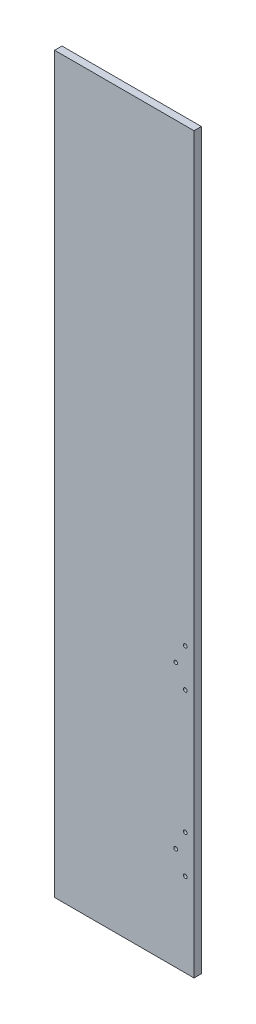
ISO-10303-21;
HEADER;
FILE_DESCRIPTION(('STEP AP214'),'2;1');
FILE_NAME('part.step','',(''),(''),'','','');
FILE_SCHEMA(('AUTOMOTIVE_DESIGN { 1 0 10303 214 1 1 1 1 }'));
ENDSEC;
DATA;
#1=APPLICATION_CONTEXT('core data for automotive mechanical design processes');
#2=APPLICATION_PROTOCOL_DEFINITION('international standard','automotive_design',2000,#1);
#3=PRODUCT_CONTEXT('',#1,'mechanical');
#4=PRODUCT('Part','Part','',(#3));
#5=PRODUCT_RELATED_PRODUCT_CATEGORY('part','',(#4));
#6=PRODUCT_DEFINITION_FORMATION('','',#4);
#7=PRODUCT_DEFINITION_CONTEXT('part definition',#1,'design');
#8=PRODUCT_DEFINITION('design','',#6,#7);
#9=PRODUCT_DEFINITION_SHAPE('','',#8);
#10=(LENGTH_UNIT() NAMED_UNIT(*) SI_UNIT(.MILLI.,.METRE.));
#11=(NAMED_UNIT(*) PLANE_ANGLE_UNIT() SI_UNIT($,.RADIAN.));
#12=(NAMED_UNIT(*) SI_UNIT($,.STERADIAN.) SOLID_ANGLE_UNIT());
#13=UNCERTAINTY_MEASURE_WITH_UNIT(LENGTH_MEASURE(1.E-05),#10,'distance_accuracy_value','');
#14=(GEOMETRIC_REPRESENTATION_CONTEXT(3) GLOBAL_UNCERTAINTY_ASSIGNED_CONTEXT((#13)) GLOBAL_UNIT_ASSIGNED_CONTEXT((#10,
#11,#12)) REPRESENTATION_CONTEXT('',''));
#15=CARTESIAN_POINT('',(0.,0.,0.));
#16=DIRECTION('',(0.,0.,1.));
#17=DIRECTION('',(1.,0.,0.));
#18=AXIS2_PLACEMENT_3D('',#15,#16,#17);
#19=CARTESIAN_POINT('',(-95.,-500.,10.));
#20=DIRECTION('',(1.,0.,0.));
#21=DIRECTION('',(0.,0.,-1.));
#22=AXIS2_PLACEMENT_3D('',#19,#20,#21);
#23=PLANE('',#22);
#24=DIRECTION('',(0.,-1.,0.));
#25=VECTOR('',#24,1.);
#26=CARTESIAN_POINT('',(-95.,-500.,0.));
#27=LINE('',#26,#25);
#28=CARTESIAN_POINT('',(-95.,500.,0.));
#29=VERTEX_POINT('',#28);
#30=CARTESIAN_POINT('',(-95.,-500.,0.));
#31=VERTEX_POINT('',#30);
#32=EDGE_CURVE('E96',#29,#31,#27,.T.);
#33=ORIENTED_EDGE('',*,*,#32,.T.);
#34=DIRECTION('',(0.,0.,-1.));
#35=VECTOR('',#34,1.);
#36=CARTESIAN_POINT('',(-95.,-500.,10.));
#37=LINE('',#36,#35);
#38=CARTESIAN_POINT('',(-95.,-500.,10.));
#39=VERTEX_POINT('',#38);
#40=EDGE_CURVE('E11',#39,#31,#37,.T.);
#41=ORIENTED_EDGE('',*,*,#40,.F.);
#42=DIRECTION('',(0.,-1.,0.));
#43=VECTOR('',#42,1.);
#44=CARTESIAN_POINT('',(-95.,-500.,10.));
#45=LINE('',#44,#43);
#46=CARTESIAN_POINT('',(-95.,500.,10.));
#47=VERTEX_POINT('',#46);
#48=EDGE_CURVE('E84',#47,#39,#45,.T.);
#49=ORIENTED_EDGE('',*,*,#48,.F.);
#50=DIRECTION('',(0.,0.,-1.));
#51=VECTOR('',#50,1.);
#52=CARTESIAN_POINT('',(-95.,500.,10.));
#53=LINE('',#52,#51);
#54=EDGE_CURVE('E92',#47,#29,#53,.T.);
#55=ORIENTED_EDGE('',*,*,#54,.T.);
#56=EDGE_LOOP('',(#33,#41,#49,#55));
#57=FACE_BOUND('',#56,.T.);
#58=ADVANCED_FACE('F33',(#57),#23,.F.);
#59=CARTESIAN_POINT('',(95.,-500.,10.));
#60=DIRECTION('',(0.,1.,0.));
#61=DIRECTION('',(0.,0.,1.));
#62=AXIS2_PLACEMENT_3D('',#59,#60,#61);
#63=PLANE('',#62);
#64=DIRECTION('',(1.,0.,0.));
#65=VECTOR('',#64,1.);
#66=CARTESIAN_POINT('',(95.,-500.,0.));
#67=LINE('',#66,#65);
#68=CARTESIAN_POINT('',(95.,-500.,0.));
#69=VERTEX_POINT('',#68);
#70=EDGE_CURVE('E88',#31,#69,#67,.T.);
#71=ORIENTED_EDGE('',*,*,#70,.T.);
#72=DIRECTION('',(0.,0.,-1.));
#73=VECTOR('',#72,1.);
#74=CARTESIAN_POINT('',(95.,-500.,10.));
#75=LINE('',#74,#73);
#76=CARTESIAN_POINT('',(95.,-500.,10.));
#77=VERTEX_POINT('',#76);
#78=EDGE_CURVE('E41',#77,#69,#75,.T.);
#79=ORIENTED_EDGE('',*,*,#78,.F.);
#80=DIRECTION('',(1.,0.,0.));
#81=VECTOR('',#80,1.);
#82=CARTESIAN_POINT('',(95.,-500.,10.));
#83=LINE('',#82,#81);
#84=EDGE_CURVE('E79',#39,#77,#83,.T.);
#85=ORIENTED_EDGE('',*,*,#84,.F.);
#86=ORIENTED_EDGE('',*,*,#40,.T.);
#87=EDGE_LOOP('',(#71,#79,#85,#86));
#88=FACE_BOUND('',#87,.T.);
#89=ADVANCED_FACE('F87',(#88),#63,.F.);
#90=CARTESIAN_POINT('',(95.,-500.,10.));
#91=DIRECTION('',(-1.,0.,0.));
#92=DIRECTION('',(0.,0.,1.));
#93=AXIS2_PLACEMENT_3D('',#90,#91,#92);
#94=PLANE('',#93);
#95=DIRECTION('',(0.,1.,0.));
#96=VECTOR('',#95,1.);
#97=CARTESIAN_POINT('',(95.,-500.,0.));
#98=LINE('',#97,#96);
#99=CARTESIAN_POINT('',(95.,500.,0.));
#100=VERTEX_POINT('',#99);
#101=EDGE_CURVE('E66',#69,#100,#98,.T.);
#102=ORIENTED_EDGE('',*,*,#101,.T.);
#103=DIRECTION('',(0.,0.,-1.));
#104=VECTOR('',#103,1.);
#105=CARTESIAN_POINT('',(95.,500.,10.));
#106=LINE('',#105,#104);
#107=CARTESIAN_POINT('',(95.,500.,10.));
#108=VERTEX_POINT('',#107);
#109=EDGE_CURVE('E89',#108,#100,#106,.T.);
#110=ORIENTED_EDGE('',*,*,#109,.F.);
#111=DIRECTION('',(0.,1.,0.));
#112=VECTOR('',#111,1.);
#113=CARTESIAN_POINT('',(95.,-500.,10.));
#114=LINE('',#113,#112);
#115=EDGE_CURVE('E82',#77,#108,#114,.T.);
#116=ORIENTED_EDGE('',*,*,#115,.F.);
#117=ORIENTED_EDGE('',*,*,#78,.T.);
#118=EDGE_LOOP('',(#102,#110,#116,#117));
#119=FACE_BOUND('',#118,.T.);
#120=ADVANCED_FACE('F90',(#119),#94,.F.);
#121=CARTESIAN_POINT('',(95.,500.,10.));
#122=DIRECTION('',(0.,-1.,0.));
#123=DIRECTION('',(0.,0.,-1.));
#124=AXIS2_PLACEMENT_3D('',#121,#122,#123);
#125=PLANE('',#124);
#126=DIRECTION('',(-1.,0.,0.));
#127=VECTOR('',#126,1.);
#128=CARTESIAN_POINT('',(95.,500.,0.));
#129=LINE('',#128,#127);
#130=EDGE_CURVE('E72',#100,#29,#129,.T.);
#131=ORIENTED_EDGE('',*,*,#130,.T.);
#132=ORIENTED_EDGE('',*,*,#54,.F.);
#133=DIRECTION('',(-1.,0.,0.));
#134=VECTOR('',#133,1.);
#135=CARTESIAN_POINT('',(95.,500.,10.));
#136=LINE('',#135,#134);
#137=EDGE_CURVE('E49',#108,#47,#136,.T.);
#138=ORIENTED_EDGE('',*,*,#137,.F.);
#139=ORIENTED_EDGE('',*,*,#109,.T.);
#140=EDGE_LOOP('',(#131,#132,#138,#139));
#141=FACE_BOUND('',#140,.T.);
#142=ADVANCED_FACE('F104',(#141),#125,.F.);
#143=CARTESIAN_POINT('',(0.,0.,10.));
#144=DIRECTION('',(0.,0.,1.));
#145=DIRECTION('',(1.,0.,0.));
#146=AXIS2_PLACEMENT_3D('',#143,#144,#145);
#147=PLANE('',#146);
#148=CARTESIAN_POINT('',(70.,-360.,10.));
#149=DIRECTION('',(0.,0.,1.));
#150=DIRECTION('',(1.,0.,0.));
#151=AXIS2_PLACEMENT_3D('',#148,#149,#150);
#152=CIRCLE('',#151,2.5);
#153=CARTESIAN_POINT('',(72.5,-360.,10.));
#154=VERTEX_POINT('',#153);
#155=EDGE_CURVE('E140',#154,#154,#152,.T.);
#156=ORIENTED_EDGE('',*,*,#155,.F.);
#157=EDGE_LOOP('',(#156));
#158=FACE_BOUND('',#157,.T.);
#159=CARTESIAN_POINT('',(83.,-334.,10.));
#160=DIRECTION('',(0.,0.,1.));
#161=DIRECTION('',(1.,0.,0.));
#162=AXIS2_PLACEMENT_3D('',#159,#160,#161);
#163=CIRCLE('',#162,2.50000000000001);
#164=CARTESIAN_POINT('',(85.5,-334.,10.));
#165=VERTEX_POINT('',#164);
#166=EDGE_CURVE('E134',#165,#165,#163,.T.);
#167=ORIENTED_EDGE('',*,*,#166,.F.);
#168=EDGE_LOOP('',(#167));
#169=FACE_BOUND('',#168,.T.);
#170=CARTESIAN_POINT('',(83.,-166.,10.));
#171=DIRECTION('',(0.,0.,1.));
#172=DIRECTION('',(1.,0.,0.));
#173=AXIS2_PLACEMENT_3D('',#170,#171,#172);
#174=CIRCLE('',#173,2.50000000000001);
#175=CARTESIAN_POINT('',(85.5,-166.,10.));
#176=VERTEX_POINT('',#175);
#177=EDGE_CURVE('E128',#176,#176,#174,.T.);
#178=ORIENTED_EDGE('',*,*,#177,.F.);
#179=EDGE_LOOP('',(#178));
#180=FACE_BOUND('',#179,.T.);
#181=CARTESIAN_POINT('',(70.,-140.,10.));
#182=DIRECTION('',(0.,0.,1.));
#183=DIRECTION('',(1.,0.,0.));
#184=AXIS2_PLACEMENT_3D('',#181,#182,#183);
#185=CIRCLE('',#184,2.5);
#186=CARTESIAN_POINT('',(72.5,-140.,10.));
#187=VERTEX_POINT('',#186);
#188=EDGE_CURVE('E122',#187,#187,#185,.T.);
#189=ORIENTED_EDGE('',*,*,#188,.F.);
#190=EDGE_LOOP('',(#189));
#191=FACE_BOUND('',#190,.T.);
#192=CARTESIAN_POINT('',(83.,-114.,10.));
#193=DIRECTION('',(0.,0.,1.));
#194=DIRECTION('',(1.,0.,0.));
#195=AXIS2_PLACEMENT_3D('',#192,#193,#194);
#196=CIRCLE('',#195,2.50000000000001);
#197=CARTESIAN_POINT('',(85.5,-114.,10.));
#198=VERTEX_POINT('',#197);
#199=EDGE_CURVE('E116',#198,#198,#196,.T.);
#200=ORIENTED_EDGE('',*,*,#199,.F.);
#201=EDGE_LOOP('',(#200));
#202=FACE_BOUND('',#201,.T.);
#203=CARTESIAN_POINT('',(83.,-386.,10.));
#204=DIRECTION('',(0.,0.,1.));
#205=DIRECTION('',(1.,0.,0.));
#206=AXIS2_PLACEMENT_3D('',#203,#204,#205);
#207=CIRCLE('',#206,2.5);
#208=CARTESIAN_POINT('',(85.5,-386.,10.));
#209=VERTEX_POINT('',#208);
#210=EDGE_CURVE('E110',#209,#209,#207,.T.);
#211=ORIENTED_EDGE('',*,*,#210,.F.);
#212=EDGE_LOOP('',(#211));
#213=FACE_BOUND('',#212,.T.);
#214=ORIENTED_EDGE('',*,*,#48,.T.);
#215=ORIENTED_EDGE('',*,*,#84,.T.);
#216=ORIENTED_EDGE('',*,*,#115,.T.);
#217=ORIENTED_EDGE('',*,*,#137,.T.);
#218=EDGE_LOOP('',(#214,#215,#216,#217));
#219=FACE_BOUND('',#218,.T.);
#220=ADVANCED_FACE('F80',(#158,#169,#180,#191,#202,#213,#219),#147,.T.);
#221=CARTESIAN_POINT('',(0.,0.,0.));
#222=DIRECTION('',(0.,0.,1.));
#223=DIRECTION('',(1.,0.,0.));
#224=AXIS2_PLACEMENT_3D('',#221,#222,#223);
#225=PLANE('',#224);
#226=CARTESIAN_POINT('',(70.,-360.,0.));
#227=DIRECTION('',(0.,0.,1.));
#228=DIRECTION('',(1.,0.,0.));
#229=AXIS2_PLACEMENT_3D('',#226,#227,#228);
#230=CIRCLE('',#229,2.5);
#231=CARTESIAN_POINT('',(72.5,-360.,0.));
#232=VERTEX_POINT('',#231);
#233=EDGE_CURVE('E113',#232,#232,#230,.T.);
#234=ORIENTED_EDGE('',*,*,#233,.T.);
#235=EDGE_LOOP('',(#234));
#236=FACE_BOUND('',#235,.T.);
#237=CARTESIAN_POINT('',(83.,-334.,0.));
#238=DIRECTION('',(0.,0.,1.));
#239=DIRECTION('',(1.,0.,0.));
#240=AXIS2_PLACEMENT_3D('',#237,#238,#239);
#241=CIRCLE('',#240,2.50000000000001);
#242=CARTESIAN_POINT('',(85.5,-334.,0.));
#243=VERTEX_POINT('',#242);
#244=EDGE_CURVE('E137',#243,#243,#241,.T.);
#245=ORIENTED_EDGE('',*,*,#244,.T.);
#246=EDGE_LOOP('',(#245));
#247=FACE_BOUND('',#246,.T.);
#248=CARTESIAN_POINT('',(83.,-166.,0.));
#249=DIRECTION('',(0.,0.,1.));
#250=DIRECTION('',(1.,0.,0.));
#251=AXIS2_PLACEMENT_3D('',#248,#249,#250);
#252=CIRCLE('',#251,2.50000000000001);
#253=CARTESIAN_POINT('',(85.5,-166.,0.));
#254=VERTEX_POINT('',#253);
#255=EDGE_CURVE('E131',#254,#254,#252,.T.);
#256=ORIENTED_EDGE('',*,*,#255,.T.);
#257=EDGE_LOOP('',(#256));
#258=FACE_BOUND('',#257,.T.);
#259=CARTESIAN_POINT('',(70.,-140.,0.));
#260=DIRECTION('',(0.,0.,1.));
#261=DIRECTION('',(1.,0.,0.));
#262=AXIS2_PLACEMENT_3D('',#259,#260,#261);
#263=CIRCLE('',#262,2.5);
#264=CARTESIAN_POINT('',(72.5,-140.,0.));
#265=VERTEX_POINT('',#264);
#266=EDGE_CURVE('E125',#265,#265,#263,.T.);
#267=ORIENTED_EDGE('',*,*,#266,.T.);
#268=EDGE_LOOP('',(#267));
#269=FACE_BOUND('',#268,.T.);
#270=CARTESIAN_POINT('',(83.,-114.,0.));
#271=DIRECTION('',(0.,0.,1.));
#272=DIRECTION('',(1.,0.,0.));
#273=AXIS2_PLACEMENT_3D('',#270,#271,#272);
#274=CIRCLE('',#273,2.50000000000001);
#275=CARTESIAN_POINT('',(85.5,-114.,0.));
#276=VERTEX_POINT('',#275);
#277=EDGE_CURVE('E119',#276,#276,#274,.T.);
#278=ORIENTED_EDGE('',*,*,#277,.T.);
#279=EDGE_LOOP('',(#278));
#280=FACE_BOUND('',#279,.T.);
#281=CARTESIAN_POINT('',(83.,-386.,0.));
#282=DIRECTION('',(0.,0.,1.));
#283=DIRECTION('',(1.,0.,0.));
#284=AXIS2_PLACEMENT_3D('',#281,#282,#283);
#285=CIRCLE('',#284,2.5);
#286=CARTESIAN_POINT('',(85.5,-386.,0.));
#287=VERTEX_POINT('',#286);
#288=EDGE_CURVE('E99',#287,#287,#285,.T.);
#289=ORIENTED_EDGE('',*,*,#288,.T.);
#290=EDGE_LOOP('',(#289));
#291=FACE_BOUND('',#290,.T.);
#292=ORIENTED_EDGE('',*,*,#32,.F.);
#293=ORIENTED_EDGE('',*,*,#130,.F.);
#294=ORIENTED_EDGE('',*,*,#101,.F.);
#295=ORIENTED_EDGE('',*,*,#70,.F.);
#296=EDGE_LOOP('',(#292,#293,#294,#295));
#297=FACE_BOUND('',#296,.T.);
#298=ADVANCED_FACE('F107',(#236,#247,#258,#269,#280,#291,#297),#225,.F.);
#299=CARTESIAN_POINT('',(83.,-386.,0.));
#300=DIRECTION('',(0.,0.,1.));
#301=DIRECTION('',(1.,0.,0.));
#302=AXIS2_PLACEMENT_3D('',#299,#300,#301);
#303=CYLINDRICAL_SURFACE('',#302,2.5);
#304=ORIENTED_EDGE('',*,*,#288,.F.);
#305=EDGE_LOOP('',(#304));
#306=FACE_BOUND('',#305,.T.);
#307=ORIENTED_EDGE('',*,*,#210,.T.);
#308=EDGE_LOOP('',(#307));
#309=FACE_BOUND('',#308,.T.);
#310=ADVANCED_FACE('F168',(#306,#309),#303,.F.);
#311=CARTESIAN_POINT('',(83.,-114.,0.));
#312=DIRECTION('',(0.,0.,1.));
#313=DIRECTION('',(1.,0.,0.));
#314=AXIS2_PLACEMENT_3D('',#311,#312,#313);
#315=CYLINDRICAL_SURFACE('',#314,2.50000000000001);
#316=ORIENTED_EDGE('',*,*,#277,.F.);
#317=EDGE_LOOP('',(#316));
#318=FACE_BOUND('',#317,.T.);
#319=ORIENTED_EDGE('',*,*,#199,.T.);
#320=EDGE_LOOP('',(#319));
#321=FACE_BOUND('',#320,.T.);
#322=ADVANCED_FACE('F170',(#318,#321),#315,.F.);
#323=CARTESIAN_POINT('',(70.,-140.,0.));
#324=DIRECTION('',(0.,0.,1.));
#325=DIRECTION('',(1.,0.,0.));
#326=AXIS2_PLACEMENT_3D('',#323,#324,#325);
#327=CYLINDRICAL_SURFACE('',#326,2.5);
#328=ORIENTED_EDGE('',*,*,#266,.F.);
#329=EDGE_LOOP('',(#328));
#330=FACE_BOUND('',#329,.T.);
#331=ORIENTED_EDGE('',*,*,#188,.T.);
#332=EDGE_LOOP('',(#331));
#333=FACE_BOUND('',#332,.T.);
#334=ADVANCED_FACE('F177',(#330,#333),#327,.F.);
#335=CARTESIAN_POINT('',(83.,-166.,0.));
#336=DIRECTION('',(0.,0.,1.));
#337=DIRECTION('',(1.,0.,0.));
#338=AXIS2_PLACEMENT_3D('',#335,#336,#337);
#339=CYLINDRICAL_SURFACE('',#338,2.50000000000001);
#340=ORIENTED_EDGE('',*,*,#255,.F.);
#341=EDGE_LOOP('',(#340));
#342=FACE_BOUND('',#341,.T.);
#343=ORIENTED_EDGE('',*,*,#177,.T.);
#344=EDGE_LOOP('',(#343));
#345=FACE_BOUND('',#344,.T.);
#346=ADVANCED_FACE('F223',(#342,#345),#339,.F.);
#347=CARTESIAN_POINT('',(83.,-334.,0.));
#348=DIRECTION('',(0.,0.,1.));
#349=DIRECTION('',(1.,0.,0.));
#350=AXIS2_PLACEMENT_3D('',#347,#348,#349);
#351=CYLINDRICAL_SURFACE('',#350,2.50000000000001);
#352=ORIENTED_EDGE('',*,*,#244,.F.);
#353=EDGE_LOOP('',(#352));
#354=FACE_BOUND('',#353,.T.);
#355=ORIENTED_EDGE('',*,*,#166,.T.);
#356=EDGE_LOOP('',(#355));
#357=FACE_BOUND('',#356,.T.);
#358=ADVANCED_FACE('F151',(#354,#357),#351,.F.);
#359=CARTESIAN_POINT('',(70.,-360.,0.));
#360=DIRECTION('',(0.,0.,1.));
#361=DIRECTION('',(1.,0.,0.));
#362=AXIS2_PLACEMENT_3D('',#359,#360,#361);
#363=CYLINDRICAL_SURFACE('',#362,2.5);
#364=ORIENTED_EDGE('',*,*,#233,.F.);
#365=EDGE_LOOP('',(#364));
#366=FACE_BOUND('',#365,.T.);
#367=ORIENTED_EDGE('',*,*,#155,.T.);
#368=EDGE_LOOP('',(#367));
#369=FACE_BOUND('',#368,.T.);
#370=ADVANCED_FACE('F148',(#366,#369),#363,.F.);
#371=CLOSED_SHELL('',(#58,#89,#120,#142,#220,#298,#310,#322,#334,#346,#358,#370));
#372=MANIFOLD_SOLID_BREP('B2',#371);
#373=ADVANCED_BREP_SHAPE_REPRESENTATION('',(#18,#372),#14);
#374=SHAPE_DEFINITION_REPRESENTATION(#9,#373);
ENDSEC;
END-ISO-10303-21;
